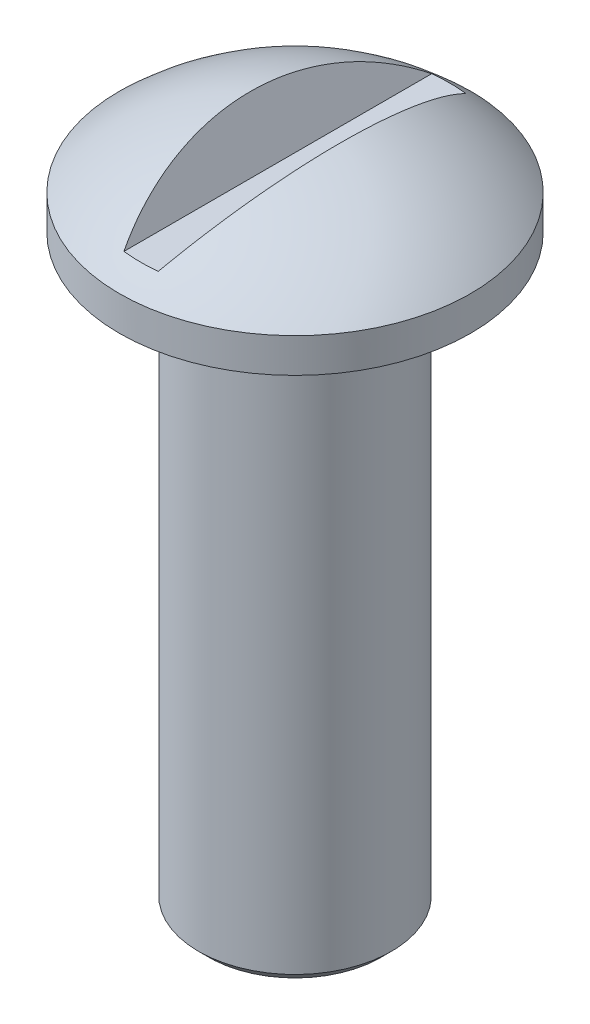
ISO-10303-21;
HEADER;
FILE_DESCRIPTION(('STEP AP214'),'2;1');
FILE_NAME('part.step','',(''),(''),'','','');
FILE_SCHEMA(('AUTOMOTIVE_DESIGN { 1 0 10303 214 1 1 1 1 }'));
ENDSEC;
DATA;
#1=APPLICATION_CONTEXT('core data for automotive mechanical design processes');
#2=APPLICATION_PROTOCOL_DEFINITION('international standard','automotive_design',2000,#1);
#3=PRODUCT_CONTEXT('',#1,'mechanical');
#4=PRODUCT('Part','Part','',(#3));
#5=PRODUCT_RELATED_PRODUCT_CATEGORY('part','',(#4));
#6=PRODUCT_DEFINITION_FORMATION('','',#4);
#7=PRODUCT_DEFINITION_CONTEXT('part definition',#1,'design');
#8=PRODUCT_DEFINITION('design','',#6,#7);
#9=PRODUCT_DEFINITION_SHAPE('','',#8);
#10=(LENGTH_UNIT() NAMED_UNIT(*) SI_UNIT(.MILLI.,.METRE.));
#11=(NAMED_UNIT(*) PLANE_ANGLE_UNIT() SI_UNIT($,.RADIAN.));
#12=(NAMED_UNIT(*) SI_UNIT($,.STERADIAN.) SOLID_ANGLE_UNIT());
#13=UNCERTAINTY_MEASURE_WITH_UNIT(LENGTH_MEASURE(1.E-05),#10,'distance_accuracy_value','');
#14=(GEOMETRIC_REPRESENTATION_CONTEXT(3) GLOBAL_UNCERTAINTY_ASSIGNED_CONTEXT((#13)) GLOBAL_UNIT_ASSIGNED_CONTEXT((#10,
#11,#12)) REPRESENTATION_CONTEXT('',''));
#15=CARTESIAN_POINT('',(0.,0.,0.));
#16=DIRECTION('',(0.,0.,1.));
#17=DIRECTION('',(1.,0.,0.));
#18=AXIS2_PLACEMENT_3D('',#15,#16,#17);
#19=CARTESIAN_POINT('',(0.,31.75,0.));
#20=DIRECTION('',(0.,-1.,0.));
#21=DIRECTION('',(1.,0.,0.));
#22=AXIS2_PLACEMENT_3D('',#19,#20,#21);
#23=SPHERICAL_SURFACE('',#22,19.05);
#24=CARTESIAN_POINT('',(0.,45.72,0.));
#25=DIRECTION('',(0.,-1.,0.));
#26=DIRECTION('',(0.,0.,-1.));
#27=AXIS2_PLACEMENT_3D('',#24,#25,#26);
#28=CIRCLE('',#27,12.9515095645257);
#29=CARTESIAN_POINT('',(0.,45.72,-12.9515095645257));
#30=VERTEX_POINT('',#29);
#31=EDGE_CURVE('E104',#30,#30,#28,.T.);
#32=ORIENTED_EDGE('',*,*,#31,.F.);
#33=EDGE_LOOP('',(#32));
#34=FACE_BOUND('',#33,.T.);
#35=CARTESIAN_POINT('',(0.,46.99,0.));
#36=DIRECTION('',(0.,1.,0.));
#37=DIRECTION('',(0.,0.,1.));
#38=AXIS2_PLACEMENT_3D('',#35,#36,#37);
#39=CIRCLE('',#38,11.43);
#40=CARTESIAN_POINT('',(1.27,46.99,-11.359225325699));
#41=VERTEX_POINT('',#40);
#42=CARTESIAN_POINT('',(-1.27,46.99,-11.359225325699));
#43=VERTEX_POINT('',#42);
#44=EDGE_CURVE('E11',#41,#43,#39,.T.);
#45=ORIENTED_EDGE('',*,*,#44,.F.);
#46=CARTESIAN_POINT('',(-5.64661357683743,35.0100738685969,0.));
#47=DIRECTION('',(0.866025403784438,-0.500000000000001,0.));
#48=DIRECTION('',(0.500000000000001,0.866025403784438,0.));
#49=AXIS2_PLACEMENT_3D('',#46,#47,#48);
#50=CIRCLE('',#49,17.899446178169);
#51=CARTESIAN_POINT('',(1.27,46.99,11.359225325699));
#52=VERTEX_POINT('',#51);
#53=EDGE_CURVE('E49',#52,#41,#50,.F.);
#54=ORIENTED_EDGE('',*,*,#53,.F.);
#55=CARTESIAN_POINT('',(-1.27,46.99,11.359225325699));
#56=VERTEX_POINT('',#55);
#57=EDGE_CURVE('E56',#56,#52,#39,.T.);
#58=ORIENTED_EDGE('',*,*,#57,.F.);
#59=CARTESIAN_POINT('',(5.64661357683743,35.0100738685969,0.));
#60=DIRECTION('',(-0.866025403784438,-0.500000000000001,0.));
#61=DIRECTION('',(0.500000000000001,-0.866025403784438,0.));
#62=AXIS2_PLACEMENT_3D('',#59,#60,#61);
#63=CIRCLE('',#62,17.899446178169);
#64=EDGE_CURVE('E79',#43,#56,#63,.F.);
#65=ORIENTED_EDGE('',*,*,#64,.F.);
#66=EDGE_LOOP('',(#45,#54,#58,#65));
#67=FACE_BOUND('',#66,.T.);
#68=ADVANCED_FACE('F45',(#34,#67),#23,.T.);
#69=CARTESIAN_POINT('',(-6.35,0.,0.));
#70=DIRECTION('',(0.,1.,0.));
#71=DIRECTION('',(0.,0.,1.));
#72=AXIS2_PLACEMENT_3D('',#69,#70,#71);
#73=PLANE('',#72);
#74=CARTESIAN_POINT('',(0.,0.,0.));
#75=DIRECTION('',(0.,-1.,0.));
#76=DIRECTION('',(0.,0.,-1.));
#77=AXIS2_PLACEMENT_3D('',#74,#75,#76);
#78=CIRCLE('',#77,6.35);
#79=CARTESIAN_POINT('',(0.,0.,-6.35));
#80=VERTEX_POINT('',#79);
#81=EDGE_CURVE('E80',#80,#80,#78,.T.);
#82=ORIENTED_EDGE('',*,*,#81,.T.);
#83=EDGE_LOOP('',(#82));
#84=FACE_BOUND('',#83,.T.);
#85=ADVANCED_FACE('F47',(#84),#73,.F.);
#86=CARTESIAN_POINT('',(0.,0.762000000000006,0.));
#87=DIRECTION('',(0.,1.,0.));
#88=DIRECTION('',(0.,0.,1.));
#89=AXIS2_PLACEMENT_3D('',#86,#87,#88);
#90=CONICAL_SURFACE('',#89,7.112,0.785398163397445);
#91=ORIENTED_EDGE('',*,*,#81,.F.);
#92=EDGE_LOOP('',(#91));
#93=FACE_BOUND('',#92,.T.);
#94=CARTESIAN_POINT('',(0.,0.762000000000006,0.));
#95=DIRECTION('',(0.,-1.,0.));
#96=DIRECTION('',(0.,0.,-1.));
#97=AXIS2_PLACEMENT_3D('',#94,#95,#96);
#98=CIRCLE('',#97,7.112);
#99=CARTESIAN_POINT('',(0.,0.762000000000006,-7.112));
#100=VERTEX_POINT('',#99);
#101=EDGE_CURVE('E92',#100,#100,#98,.T.);
#102=ORIENTED_EDGE('',*,*,#101,.T.);
#103=EDGE_LOOP('',(#102));
#104=FACE_BOUND('',#103,.T.);
#105=ADVANCED_FACE('F118',(#93,#104),#90,.T.);
#106=CARTESIAN_POINT('',(0.,-6.53481965350537,0.));
#107=DIRECTION('',(0.,-1.,0.));
#108=DIRECTION('',(0.,0.,-1.));
#109=AXIS2_PLACEMENT_3D('',#106,#107,#108);
#110=CYLINDRICAL_SURFACE('',#109,7.112);
#111=ORIENTED_EDGE('',*,*,#101,.F.);
#112=EDGE_LOOP('',(#111));
#113=FACE_BOUND('',#112,.T.);
#114=CARTESIAN_POINT('',(0.,43.18,0.));
#115=DIRECTION('',(0.,-1.,0.));
#116=DIRECTION('',(0.,0.,-1.));
#117=AXIS2_PLACEMENT_3D('',#114,#115,#116);
#118=CIRCLE('',#117,7.112);
#119=CARTESIAN_POINT('',(0.,43.18,-7.112));
#120=VERTEX_POINT('',#119);
#121=EDGE_CURVE('E96',#120,#120,#118,.T.);
#122=ORIENTED_EDGE('',*,*,#121,.T.);
#123=EDGE_LOOP('',(#122));
#124=FACE_BOUND('',#123,.T.);
#125=ADVANCED_FACE('F130',(#113,#124),#110,.T.);
#126=CARTESIAN_POINT('',(-7.112,43.18,0.));
#127=DIRECTION('',(0.,1.,0.));
#128=DIRECTION('',(0.,0.,1.));
#129=AXIS2_PLACEMENT_3D('',#126,#127,#128);
#130=PLANE('',#129);
#131=ORIENTED_EDGE('',*,*,#121,.F.);
#132=EDGE_LOOP('',(#131));
#133=FACE_BOUND('',#132,.T.);
#134=CARTESIAN_POINT('',(0.,43.18,0.));
#135=DIRECTION('',(0.,-1.,0.));
#136=DIRECTION('',(0.,0.,-1.));
#137=AXIS2_PLACEMENT_3D('',#134,#135,#136);
#138=CIRCLE('',#137,12.9515095645257);
#139=CARTESIAN_POINT('',(0.,43.18,-12.9515095645257));
#140=VERTEX_POINT('',#139);
#141=EDGE_CURVE('E100',#140,#140,#138,.T.);
#142=ORIENTED_EDGE('',*,*,#141,.T.);
#143=EDGE_LOOP('',(#142));
#144=FACE_BOUND('',#143,.T.);
#145=ADVANCED_FACE('F126',(#133,#144),#130,.F.);
#146=CARTESIAN_POINT('',(0.,-6.53481965350537,0.));
#147=DIRECTION('',(0.,-1.,0.));
#148=DIRECTION('',(0.,0.,-1.));
#149=AXIS2_PLACEMENT_3D('',#146,#147,#148);
#150=CYLINDRICAL_SURFACE('',#149,12.9515095645257);
#151=ORIENTED_EDGE('',*,*,#141,.F.);
#152=EDGE_LOOP('',(#151));
#153=FACE_BOUND('',#152,.T.);
#154=ORIENTED_EDGE('',*,*,#31,.T.);
#155=EDGE_LOOP('',(#154));
#156=FACE_BOUND('',#155,.T.);
#157=ADVANCED_FACE('F111',(#153,#156),#150,.T.);
#158=CARTESIAN_POINT('',(1.27,46.99,-13.585608869167));
#159=DIRECTION('',(0.866025403784438,-0.500000000000001,0.));
#160=DIRECTION('',(0.500000000000001,0.866025403784438,0.));
#161=AXIS2_PLACEMENT_3D('',#158,#159,#160);
#162=PLANE('',#161);
#163=ORIENTED_EDGE('',*,*,#53,.T.);
#164=DIRECTION('',(0.,0.,-1.));
#165=VECTOR('',#164,1.);
#166=CARTESIAN_POINT('',(1.27,46.99,-13.585608869167));
#167=LINE('',#166,#165);
#168=EDGE_CURVE('E74',#52,#41,#167,.T.);
#169=ORIENTED_EDGE('',*,*,#168,.F.);
#170=EDGE_LOOP('',(#163,#169));
#171=FACE_BOUND('',#170,.T.);
#172=ADVANCED_FACE('F82',(#171),#162,.F.);
#173=CARTESIAN_POINT('',(-1.27,46.99,-13.585608869167));
#174=DIRECTION('',(-0.866025403784438,-0.500000000000001,0.));
#175=DIRECTION('',(0.500000000000001,-0.866025403784438,0.));
#176=AXIS2_PLACEMENT_3D('',#173,#174,#175);
#177=PLANE('',#176);
#178=ORIENTED_EDGE('',*,*,#64,.T.);
#179=DIRECTION('',(0.,0.,1.));
#180=VECTOR('',#179,1.);
#181=CARTESIAN_POINT('',(-1.27,46.99,-13.585608869167));
#182=LINE('',#181,#180);
#183=EDGE_CURVE('E62',#43,#56,#182,.T.);
#184=ORIENTED_EDGE('',*,*,#183,.F.);
#185=EDGE_LOOP('',(#178,#184));
#186=FACE_BOUND('',#185,.T.);
#187=ADVANCED_FACE('F122',(#186),#177,.F.);
#188=CARTESIAN_POINT('',(0.,46.99,0.));
#189=DIRECTION('',(0.,1.,0.));
#190=DIRECTION('',(0.,0.,1.));
#191=AXIS2_PLACEMENT_3D('',#188,#189,#190);
#192=PLANE('',#191);
#193=ORIENTED_EDGE('',*,*,#44,.T.);
#194=ORIENTED_EDGE('',*,*,#183,.T.);
#195=ORIENTED_EDGE('',*,*,#57,.T.);
#196=ORIENTED_EDGE('',*,*,#168,.T.);
#197=EDGE_LOOP('',(#193,#194,#195,#196));
#198=FACE_BOUND('',#197,.T.);
#199=ADVANCED_FACE('F73',(#198),#192,.T.);
#200=CLOSED_SHELL('',(#68,#85,#105,#125,#145,#157,#172,#187,#199));
#201=MANIFOLD_SOLID_BREP('B2',#200);
#202=ADVANCED_BREP_SHAPE_REPRESENTATION('',(#18,#201),#14);
#203=SHAPE_DEFINITION_REPRESENTATION(#9,#202);
ENDSEC;
END-ISO-10303-21;
